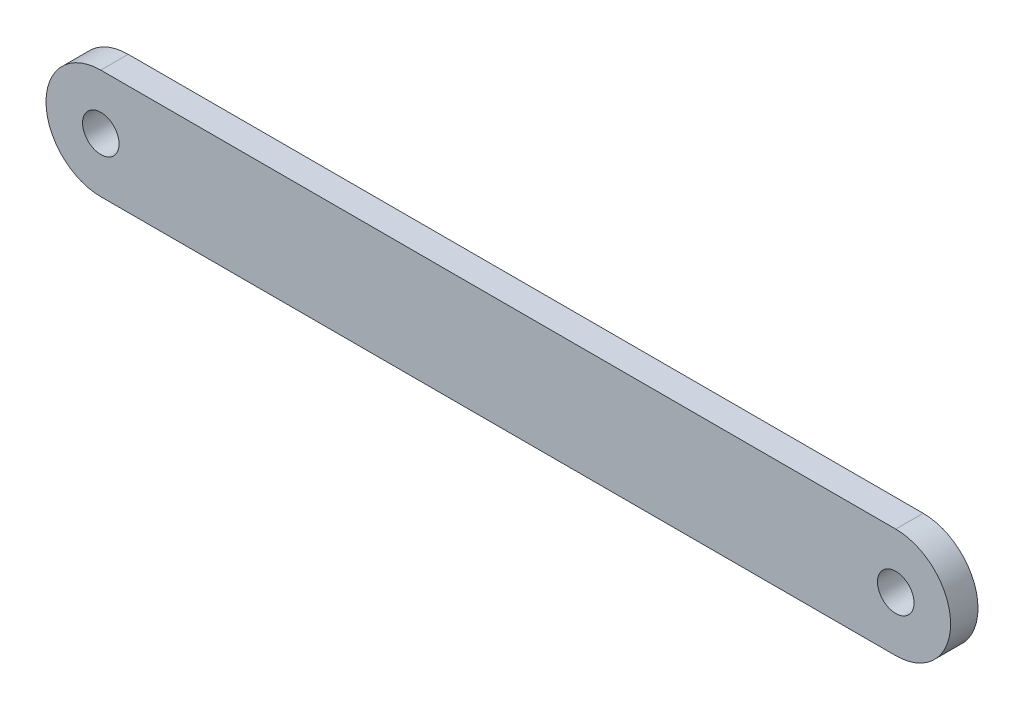
ISO-10303-21;
HEADER;
FILE_DESCRIPTION(('STEP AP214'),'2;1');
FILE_NAME('part.step','',(''),(''),'','','');
FILE_SCHEMA(('AUTOMOTIVE_DESIGN { 1 0 10303 214 1 1 1 1 }'));
ENDSEC;
DATA;
#1=APPLICATION_CONTEXT('core data for automotive mechanical design processes');
#2=APPLICATION_PROTOCOL_DEFINITION('international standard','automotive_design',2000,#1);
#3=PRODUCT_CONTEXT('',#1,'mechanical');
#4=PRODUCT('Part','Part','',(#3));
#5=PRODUCT_RELATED_PRODUCT_CATEGORY('part','',(#4));
#6=PRODUCT_DEFINITION_FORMATION('','',#4);
#7=PRODUCT_DEFINITION_CONTEXT('part definition',#1,'design');
#8=PRODUCT_DEFINITION('design','',#6,#7);
#9=PRODUCT_DEFINITION_SHAPE('','',#8);
#10=(LENGTH_UNIT() NAMED_UNIT(*) SI_UNIT(.MILLI.,.METRE.));
#11=(NAMED_UNIT(*) PLANE_ANGLE_UNIT() SI_UNIT($,.RADIAN.));
#12=(NAMED_UNIT(*) SI_UNIT($,.STERADIAN.) SOLID_ANGLE_UNIT());
#13=UNCERTAINTY_MEASURE_WITH_UNIT(LENGTH_MEASURE(1.E-05),#10,'distance_accuracy_value','');
#14=(GEOMETRIC_REPRESENTATION_CONTEXT(3) GLOBAL_UNCERTAINTY_ASSIGNED_CONTEXT((#13)) GLOBAL_UNIT_ASSIGNED_CONTEXT((#10,
#11,#12)) REPRESENTATION_CONTEXT('',''));
#15=CARTESIAN_POINT('',(0.,0.,0.));
#16=DIRECTION('',(0.,0.,1.));
#17=DIRECTION('',(1.,0.,0.));
#18=AXIS2_PLACEMENT_3D('',#15,#16,#17);
#19=CARTESIAN_POINT('',(-35.3127241673783,0.,3.));
#20=DIRECTION('',(0.,0.,1.));
#21=DIRECTION('',(1.,0.,0.));
#22=AXIS2_PLACEMENT_3D('',#19,#20,#21);
#23=PLANE('',#22);
#24=CARTESIAN_POINT('',(-35.3127241673783,0.,3.));
#25=DIRECTION('',(0.,0.,1.));
#26=DIRECTION('',(1.,0.,0.));
#27=AXIS2_PLACEMENT_3D('',#24,#25,#26);
#28=CIRCLE('',#27,2.);
#29=CARTESIAN_POINT('',(-33.3127241673783,0.,3.));
#30=VERTEX_POINT('',#29);
#31=EDGE_CURVE('E100',#30,#30,#28,.T.);
#32=ORIENTED_EDGE('',*,*,#31,.F.);
#33=EDGE_LOOP('',(#32));
#34=FACE_BOUND('',#33,.T.);
#35=CARTESIAN_POINT('',(-35.3127241673783,0.,3.));
#36=DIRECTION('',(0.,0.,1.));
#37=DIRECTION('',(1.,0.,0.));
#38=AXIS2_PLACEMENT_3D('',#35,#36,#37);
#39=CIRCLE('',#38,6.);
#40=CARTESIAN_POINT('',(-35.3127241673783,6.,3.));
#41=VERTEX_POINT('',#40);
#42=CARTESIAN_POINT('',(-35.3127241673783,-6.,3.));
#43=VERTEX_POINT('',#42);
#44=EDGE_CURVE('E85',#41,#43,#39,.T.);
#45=ORIENTED_EDGE('',*,*,#44,.T.);
#46=DIRECTION('',(1.,0.,0.));
#47=VECTOR('',#46,1.);
#48=CARTESIAN_POINT('',(-35.3127241673783,-6.,3.));
#49=LINE('',#48,#47);
#50=CARTESIAN_POINT('',(51.6872758326217,-6.,3.));
#51=VERTEX_POINT('',#50);
#52=EDGE_CURVE('E80',#43,#51,#49,.T.);
#53=ORIENTED_EDGE('',*,*,#52,.T.);
#54=CARTESIAN_POINT('',(51.6872758326217,0.,3.));
#55=DIRECTION('',(0.,0.,1.));
#56=DIRECTION('',(1.,0.,0.));
#57=AXIS2_PLACEMENT_3D('',#54,#55,#56);
#58=CIRCLE('',#57,6.);
#59=CARTESIAN_POINT('',(51.6872758326217,6.,3.));
#60=VERTEX_POINT('',#59);
#61=EDGE_CURVE('E83',#51,#60,#58,.T.);
#62=ORIENTED_EDGE('',*,*,#61,.T.);
#63=DIRECTION('',(-1.,0.,0.));
#64=VECTOR('',#63,1.);
#65=CARTESIAN_POINT('',(-35.3127241673783,6.,3.));
#66=LINE('',#65,#64);
#67=EDGE_CURVE('E50',#60,#41,#66,.T.);
#68=ORIENTED_EDGE('',*,*,#67,.T.);
#69=EDGE_LOOP('',(#45,#53,#62,#68));
#70=FACE_BOUND('',#69,.T.);
#71=CARTESIAN_POINT('',(51.6872758326217,0.,3.));
#72=DIRECTION('',(0.,0.,1.));
#73=DIRECTION('',(1.,0.,0.));
#74=AXIS2_PLACEMENT_3D('',#71,#72,#73);
#75=CIRCLE('',#74,2.);
#76=CARTESIAN_POINT('',(53.6872758326217,0.,3.));
#77=VERTEX_POINT('',#76);
#78=EDGE_CURVE('E115',#77,#77,#75,.T.);
#79=ORIENTED_EDGE('',*,*,#78,.F.);
#80=EDGE_LOOP('',(#79));
#81=FACE_BOUND('',#80,.T.);
#82=ADVANCED_FACE('F33',(#34,#70,#81),#23,.T.);
#83=CARTESIAN_POINT('',(-35.3127241673783,0.,0.));
#84=DIRECTION('',(0.,0.,1.));
#85=DIRECTION('',(1.,0.,0.));
#86=AXIS2_PLACEMENT_3D('',#83,#84,#85);
#87=PLANE('',#86);
#88=CARTESIAN_POINT('',(-35.3127241673783,0.,0.));
#89=DIRECTION('',(0.,0.,1.));
#90=DIRECTION('',(1.,0.,0.));
#91=AXIS2_PLACEMENT_3D('',#88,#89,#90);
#92=CIRCLE('',#91,2.);
#93=CARTESIAN_POINT('',(-33.3127241673783,0.,0.));
#94=VERTEX_POINT('',#93);
#95=EDGE_CURVE('E112',#94,#94,#92,.T.);
#96=ORIENTED_EDGE('',*,*,#95,.T.);
#97=EDGE_LOOP('',(#96));
#98=FACE_BOUND('',#97,.T.);
#99=CARTESIAN_POINT('',(-35.3127241673783,0.,0.));
#100=DIRECTION('',(0.,0.,1.));
#101=DIRECTION('',(1.,0.,0.));
#102=AXIS2_PLACEMENT_3D('',#99,#100,#101);
#103=CIRCLE('',#102,6.);
#104=CARTESIAN_POINT('',(-35.3127241673783,6.,0.));
#105=VERTEX_POINT('',#104);
#106=CARTESIAN_POINT('',(-35.3127241673783,-6.,0.));
#107=VERTEX_POINT('',#106);
#108=EDGE_CURVE('E97',#105,#107,#103,.T.);
#109=ORIENTED_EDGE('',*,*,#108,.F.);
#110=DIRECTION('',(-1.,0.,0.));
#111=VECTOR('',#110,1.);
#112=CARTESIAN_POINT('',(-35.3127241673783,6.,0.));
#113=LINE('',#112,#111);
#114=CARTESIAN_POINT('',(51.6872758326217,6.,0.));
#115=VERTEX_POINT('',#114);
#116=EDGE_CURVE('E73',#115,#105,#113,.T.);
#117=ORIENTED_EDGE('',*,*,#116,.F.);
#118=CARTESIAN_POINT('',(51.6872758326217,0.,0.));
#119=DIRECTION('',(0.,0.,1.));
#120=DIRECTION('',(1.,0.,0.));
#121=AXIS2_PLACEMENT_3D('',#118,#119,#120);
#122=CIRCLE('',#121,6.);
#123=CARTESIAN_POINT('',(51.6872758326217,-6.,0.));
#124=VERTEX_POINT('',#123);
#125=EDGE_CURVE('E67',#124,#115,#122,.T.);
#126=ORIENTED_EDGE('',*,*,#125,.F.);
#127=DIRECTION('',(1.,0.,0.));
#128=VECTOR('',#127,1.);
#129=CARTESIAN_POINT('',(-35.3127241673783,-6.,0.));
#130=LINE('',#129,#128);
#131=EDGE_CURVE('E89',#107,#124,#130,.T.);
#132=ORIENTED_EDGE('',*,*,#131,.F.);
#133=EDGE_LOOP('',(#109,#117,#126,#132));
#134=FACE_BOUND('',#133,.T.);
#135=CARTESIAN_POINT('',(51.6872758326217,0.,0.));
#136=DIRECTION('',(0.,0.,1.));
#137=DIRECTION('',(1.,0.,0.));
#138=AXIS2_PLACEMENT_3D('',#135,#136,#137);
#139=CIRCLE('',#138,2.);
#140=CARTESIAN_POINT('',(53.6872758326217,0.,0.));
#141=VERTEX_POINT('',#140);
#142=EDGE_CURVE('E118',#141,#141,#139,.T.);
#143=ORIENTED_EDGE('',*,*,#142,.T.);
#144=EDGE_LOOP('',(#143));
#145=FACE_BOUND('',#144,.T.);
#146=ADVANCED_FACE('F108',(#98,#134,#145),#87,.F.);
#147=CARTESIAN_POINT('',(-35.3127241673783,0.,3.));
#148=DIRECTION('',(0.,0.,-1.));
#149=DIRECTION('',(-1.,0.,0.));
#150=AXIS2_PLACEMENT_3D('',#147,#148,#149);
#151=CYLINDRICAL_SURFACE('',#150,6.);
#152=ORIENTED_EDGE('',*,*,#108,.T.);
#153=DIRECTION('',(0.,0.,-1.));
#154=VECTOR('',#153,1.);
#155=CARTESIAN_POINT('',(-35.3127241673783,-6.,3.));
#156=LINE('',#155,#154);
#157=EDGE_CURVE('E11',#43,#107,#156,.T.);
#158=ORIENTED_EDGE('',*,*,#157,.F.);
#159=ORIENTED_EDGE('',*,*,#44,.F.);
#160=DIRECTION('',(0.,0.,-1.));
#161=VECTOR('',#160,1.);
#162=CARTESIAN_POINT('',(-35.3127241673783,6.,3.));
#163=LINE('',#162,#161);
#164=EDGE_CURVE('E93',#41,#105,#163,.T.);
#165=ORIENTED_EDGE('',*,*,#164,.T.);
#166=EDGE_LOOP('',(#152,#158,#159,#165));
#167=FACE_BOUND('',#166,.T.);
#168=ADVANCED_FACE('F35',(#167),#151,.T.);
#169=CARTESIAN_POINT('',(-35.3127241673783,-6.,3.));
#170=DIRECTION('',(0.,1.,0.));
#171=DIRECTION('',(0.,0.,1.));
#172=AXIS2_PLACEMENT_3D('',#169,#170,#171);
#173=PLANE('',#172);
#174=ORIENTED_EDGE('',*,*,#131,.T.);
#175=DIRECTION('',(0.,0.,-1.));
#176=VECTOR('',#175,1.);
#177=CARTESIAN_POINT('',(51.6872758326217,-6.,3.));
#178=LINE('',#177,#176);
#179=EDGE_CURVE('E42',#51,#124,#178,.T.);
#180=ORIENTED_EDGE('',*,*,#179,.F.);
#181=ORIENTED_EDGE('',*,*,#52,.F.);
#182=ORIENTED_EDGE('',*,*,#157,.T.);
#183=EDGE_LOOP('',(#174,#180,#181,#182));
#184=FACE_BOUND('',#183,.T.);
#185=ADVANCED_FACE('F88',(#184),#173,.F.);
#186=CARTESIAN_POINT('',(51.6872758326217,0.,3.));
#187=DIRECTION('',(0.,0.,-1.));
#188=DIRECTION('',(-1.,0.,0.));
#189=AXIS2_PLACEMENT_3D('',#186,#187,#188);
#190=CYLINDRICAL_SURFACE('',#189,6.);
#191=ORIENTED_EDGE('',*,*,#125,.T.);
#192=DIRECTION('',(0.,0.,-1.));
#193=VECTOR('',#192,1.);
#194=CARTESIAN_POINT('',(51.6872758326217,6.,3.));
#195=LINE('',#194,#193);
#196=EDGE_CURVE('E90',#60,#115,#195,.T.);
#197=ORIENTED_EDGE('',*,*,#196,.F.);
#198=ORIENTED_EDGE('',*,*,#61,.F.);
#199=ORIENTED_EDGE('',*,*,#179,.T.);
#200=EDGE_LOOP('',(#191,#197,#198,#199));
#201=FACE_BOUND('',#200,.T.);
#202=ADVANCED_FACE('F91',(#201),#190,.T.);
#203=CARTESIAN_POINT('',(-35.3127241673783,6.,3.));
#204=DIRECTION('',(0.,-1.,0.));
#205=DIRECTION('',(0.,0.,-1.));
#206=AXIS2_PLACEMENT_3D('',#203,#204,#205);
#207=PLANE('',#206);
#208=ORIENTED_EDGE('',*,*,#116,.T.);
#209=ORIENTED_EDGE('',*,*,#164,.F.);
#210=ORIENTED_EDGE('',*,*,#67,.F.);
#211=ORIENTED_EDGE('',*,*,#196,.T.);
#212=EDGE_LOOP('',(#208,#209,#210,#211));
#213=FACE_BOUND('',#212,.T.);
#214=ADVANCED_FACE('F105',(#213),#207,.F.);
#215=CARTESIAN_POINT('',(-35.3127241673783,0.,3.));
#216=DIRECTION('',(0.,0.,-1.));
#217=DIRECTION('',(-1.,0.,0.));
#218=AXIS2_PLACEMENT_3D('',#215,#216,#217);
#219=CYLINDRICAL_SURFACE('',#218,2.);
#220=ORIENTED_EDGE('',*,*,#31,.T.);
#221=EDGE_LOOP('',(#220));
#222=FACE_BOUND('',#221,.T.);
#223=ORIENTED_EDGE('',*,*,#95,.F.);
#224=EDGE_LOOP('',(#223));
#225=FACE_BOUND('',#224,.T.);
#226=ADVANCED_FACE('F136',(#222,#225),#219,.F.);
#227=CARTESIAN_POINT('',(51.6872758326217,0.,3.));
#228=DIRECTION('',(0.,0.,-1.));
#229=DIRECTION('',(-1.,0.,0.));
#230=AXIS2_PLACEMENT_3D('',#227,#228,#229);
#231=CYLINDRICAL_SURFACE('',#230,2.);
#232=ORIENTED_EDGE('',*,*,#78,.T.);
#233=EDGE_LOOP('',(#232));
#234=FACE_BOUND('',#233,.T.);
#235=ORIENTED_EDGE('',*,*,#142,.F.);
#236=EDGE_LOOP('',(#235));
#237=FACE_BOUND('',#236,.T.);
#238=ADVANCED_FACE('F124',(#234,#237),#231,.F.);
#239=CLOSED_SHELL('',(#82,#146,#168,#185,#202,#214,#226,#238));
#240=MANIFOLD_SOLID_BREP('B2',#239);
#241=ADVANCED_BREP_SHAPE_REPRESENTATION('',(#18,#240),#14);
#242=SHAPE_DEFINITION_REPRESENTATION(#9,#241);
ENDSEC;
END-ISO-10303-21;
